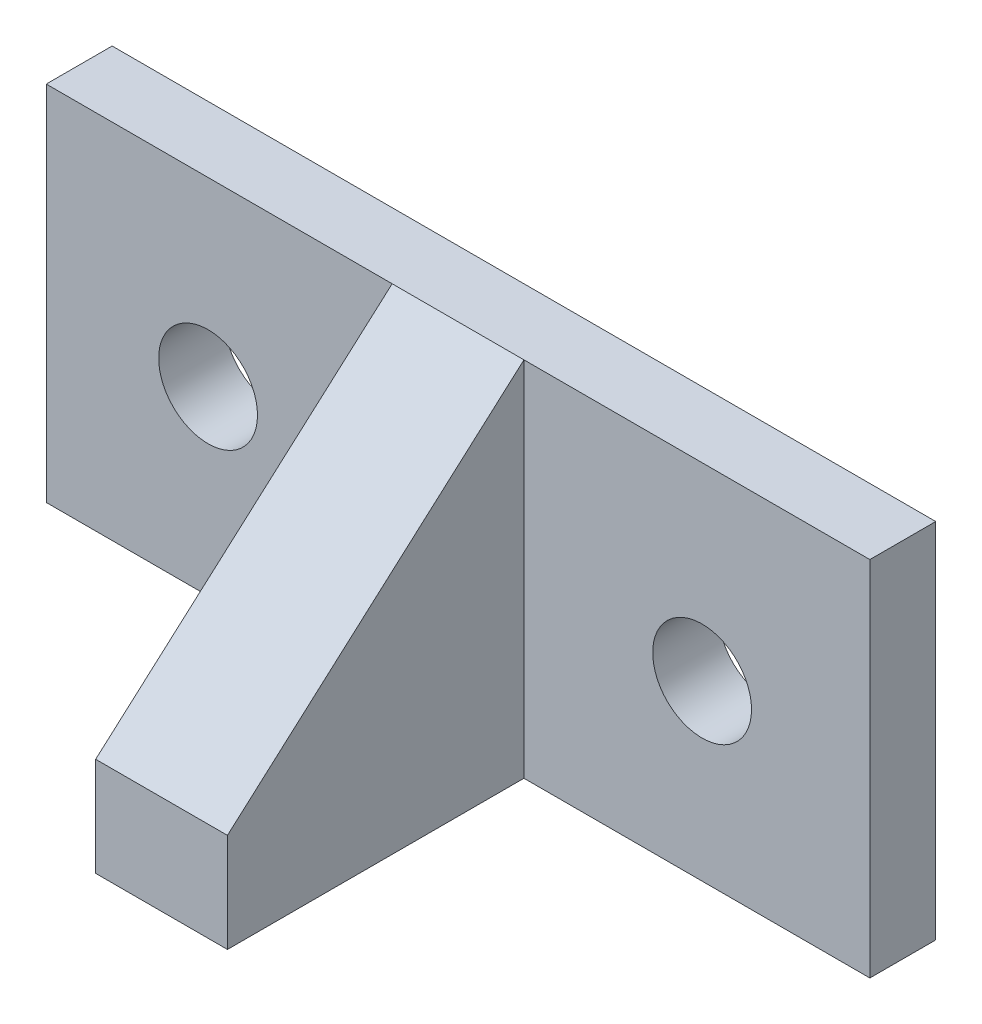
ISO-10303-21;
HEADER;
FILE_DESCRIPTION(('STEP AP214'),'2;1');
FILE_NAME('part.step','',(''),(''),'','','');
FILE_SCHEMA(('AUTOMOTIVE_DESIGN { 1 0 10303 214 1 1 1 1 }'));
ENDSEC;
DATA;
#1=APPLICATION_CONTEXT('core data for automotive mechanical design processes');
#2=APPLICATION_PROTOCOL_DEFINITION('international standard','automotive_design',2000,#1);
#3=PRODUCT_CONTEXT('',#1,'mechanical');
#4=PRODUCT('Part','Part','',(#3));
#5=PRODUCT_RELATED_PRODUCT_CATEGORY('part','',(#4));
#6=PRODUCT_DEFINITION_FORMATION('','',#4);
#7=PRODUCT_DEFINITION_CONTEXT('part definition',#1,'design');
#8=PRODUCT_DEFINITION('design','',#6,#7);
#9=PRODUCT_DEFINITION_SHAPE('','',#8);
#10=(LENGTH_UNIT() NAMED_UNIT(*) SI_UNIT(.MILLI.,.METRE.));
#11=(NAMED_UNIT(*) PLANE_ANGLE_UNIT() SI_UNIT($,.RADIAN.));
#12=(NAMED_UNIT(*) SI_UNIT($,.STERADIAN.) SOLID_ANGLE_UNIT());
#13=UNCERTAINTY_MEASURE_WITH_UNIT(LENGTH_MEASURE(1.E-05),#10,'distance_accuracy_value','');
#14=(GEOMETRIC_REPRESENTATION_CONTEXT(3) GLOBAL_UNCERTAINTY_ASSIGNED_CONTEXT((#13)) GLOBAL_UNIT_ASSIGNED_CONTEXT((#10,
#11,#12)) REPRESENTATION_CONTEXT('',''));
#15=CARTESIAN_POINT('',(0.,0.,0.));
#16=DIRECTION('',(0.,0.,1.));
#17=DIRECTION('',(1.,0.,0.));
#18=AXIS2_PLACEMENT_3D('',#15,#16,#17);
#19=CARTESIAN_POINT('',(-125.,0.,0.));
#20=DIRECTION('',(0.,0.,1.));
#21=DIRECTION('',(0.,-1.,0.));
#22=AXIS2_PLACEMENT_3D('',#19,#20,#21);
#23=PLANE('',#22);
#24=DIRECTION('',(0.,-1.,0.));
#25=VECTOR('',#24,1.);
#26=CARTESIAN_POINT('',(0.,0.,0.));
#27=LINE('',#26,#25);
#28=CARTESIAN_POINT('',(0.,27.5,0.));
#29=VERTEX_POINT('',#28);
#30=CARTESIAN_POINT('',(0.,-27.5,0.));
#31=VERTEX_POINT('',#30);
#32=EDGE_CURVE('E151',#29,#31,#27,.T.);
#33=ORIENTED_EDGE('',*,*,#32,.T.);
#34=DIRECTION('',(1.,0.,0.));
#35=VECTOR('',#34,1.);
#36=CARTESIAN_POINT('',(-125.,-27.5,0.));
#37=LINE('',#36,#35);
#38=CARTESIAN_POINT('',(-125.,-27.5,0.));
#39=VERTEX_POINT('',#38);
#40=EDGE_CURVE('E158',#39,#31,#37,.T.);
#41=ORIENTED_EDGE('',*,*,#40,.F.);
#42=DIRECTION('',(0.,-1.,0.));
#43=VECTOR('',#42,1.);
#44=CARTESIAN_POINT('',(-125.,0.,0.));
#45=LINE('',#44,#43);
#46=CARTESIAN_POINT('',(-125.,27.5,0.));
#47=VERTEX_POINT('',#46);
#48=EDGE_CURVE('E84',#47,#39,#45,.T.);
#49=ORIENTED_EDGE('',*,*,#48,.F.);
#50=DIRECTION('',(1.,0.,0.));
#51=VECTOR('',#50,1.);
#52=CARTESIAN_POINT('',(-125.,27.5,0.));
#53=LINE('',#52,#51);
#54=EDGE_CURVE('E76',#47,#29,#53,.T.);
#55=ORIENTED_EDGE('',*,*,#54,.T.);
#56=EDGE_LOOP('',(#33,#41,#49,#55));
#57=FACE_BOUND('',#56,.T.);
#58=CARTESIAN_POINT('',(-25.4583260394732,-1.19751441819342,0.));
#59=DIRECTION('',(0.,0.,1.));
#60=DIRECTION('',(1.,0.,0.));
#61=AXIS2_PLACEMENT_3D('',#58,#59,#60);
#62=CIRCLE('',#61,7.5);
#63=CARTESIAN_POINT('',(-17.9583260394732,-1.19751441819342,0.));
#64=VERTEX_POINT('',#63);
#65=EDGE_CURVE('E192',#64,#64,#62,.F.);
#66=ORIENTED_EDGE('',*,*,#65,.F.);
#67=EDGE_LOOP('',(#66));
#68=FACE_BOUND('',#67,.T.);
#69=CARTESIAN_POINT('',(-100.439200618626,0.,0.));
#70=DIRECTION('',(0.,0.,1.));
#71=DIRECTION('',(1.,0.,0.));
#72=AXIS2_PLACEMENT_3D('',#69,#70,#71);
#73=CIRCLE('',#72,7.5);
#74=CARTESIAN_POINT('',(-92.9392006186265,0.,0.));
#75=VERTEX_POINT('',#74);
#76=EDGE_CURVE('E189',#75,#75,#73,.T.);
#77=ORIENTED_EDGE('',*,*,#76,.T.);
#78=EDGE_LOOP('',(#77));
#79=FACE_BOUND('',#78,.T.);
#80=ADVANCED_FACE('F41',(#57,#68,#79),#23,.F.);
#81=CARTESIAN_POINT('',(-125.,20.3275862068966,18.0689655172414));
#82=DIRECTION('',(0.,-0.74740931868366,-0.66436383882992));
#83=DIRECTION('',(0.,0.66436383882992,-0.74740931868366));
#84=AXIS2_PLACEMENT_3D('',#81,#82,#83);
#85=PLANE('',#84);
#86=DIRECTION('',(0.,0.66436383882992,-0.74740931868366));
#87=VECTOR('',#86,1.);
#88=CARTESIAN_POINT('',(-72.5,20.3275862068966,18.0689655172414));
#89=LINE('',#88,#87);
#90=CARTESIAN_POINT('',(-72.5,-12.5,55.));
#91=VERTEX_POINT('',#90);
#92=CARTESIAN_POINT('',(-72.5,27.5,10.));
#93=VERTEX_POINT('',#92);
#94=EDGE_CURVE('E123',#91,#93,#89,.T.);
#95=ORIENTED_EDGE('',*,*,#94,.F.);
#96=DIRECTION('',(1.,0.,0.));
#97=VECTOR('',#96,1.);
#98=CARTESIAN_POINT('',(-125.,-12.5,55.));
#99=LINE('',#98,#97);
#100=CARTESIAN_POINT('',(-52.5,-12.5,55.));
#101=VERTEX_POINT('',#100);
#102=EDGE_CURVE('E44',#91,#101,#99,.T.);
#103=ORIENTED_EDGE('',*,*,#102,.T.);
#104=DIRECTION('',(0.,0.66436383882992,-0.74740931868366));
#105=VECTOR('',#104,1.);
#106=CARTESIAN_POINT('',(-52.5,20.3275862068966,18.0689655172414));
#107=LINE('',#106,#105);
#108=CARTESIAN_POINT('',(-52.5,27.5,10.));
#109=VERTEX_POINT('',#108);
#110=EDGE_CURVE('E131',#101,#109,#107,.T.);
#111=ORIENTED_EDGE('',*,*,#110,.T.);
#112=DIRECTION('',(1.,0.,0.));
#113=VECTOR('',#112,1.);
#114=CARTESIAN_POINT('',(-125.,27.5,10.));
#115=LINE('',#114,#113);
#116=EDGE_CURVE('E49',#93,#109,#115,.T.);
#117=ORIENTED_EDGE('',*,*,#116,.F.);
#118=EDGE_LOOP('',(#95,#103,#111,#117));
#119=FACE_BOUND('',#118,.T.);
#120=ADVANCED_FACE('F43',(#119),#85,.F.);
#121=CARTESIAN_POINT('',(-125.,0.,55.));
#122=DIRECTION('',(0.,0.,-1.));
#123=DIRECTION('',(-1.,0.,0.));
#124=AXIS2_PLACEMENT_3D('',#121,#122,#123);
#125=PLANE('',#124);
#126=DIRECTION('',(0.,1.,0.));
#127=VECTOR('',#126,1.);
#128=CARTESIAN_POINT('',(-72.5,0.,55.));
#129=LINE('',#128,#127);
#130=CARTESIAN_POINT('',(-72.5,-27.5,55.));
#131=VERTEX_POINT('',#130);
#132=EDGE_CURVE('E130',#131,#91,#129,.T.);
#133=ORIENTED_EDGE('',*,*,#132,.F.);
#134=DIRECTION('',(1.,0.,0.));
#135=VECTOR('',#134,1.);
#136=CARTESIAN_POINT('',(-125.,-27.5,55.));
#137=LINE('',#136,#135);
#138=CARTESIAN_POINT('',(-52.5,-27.5,55.));
#139=VERTEX_POINT('',#138);
#140=EDGE_CURVE('E141',#131,#139,#137,.T.);
#141=ORIENTED_EDGE('',*,*,#140,.T.);
#142=DIRECTION('',(0.,1.,0.));
#143=VECTOR('',#142,1.);
#144=CARTESIAN_POINT('',(-52.5,0.,55.));
#145=LINE('',#144,#143);
#146=EDGE_CURVE('E164',#139,#101,#145,.T.);
#147=ORIENTED_EDGE('',*,*,#146,.T.);
#148=ORIENTED_EDGE('',*,*,#102,.F.);
#149=EDGE_LOOP('',(#133,#141,#147,#148));
#150=FACE_BOUND('',#149,.T.);
#151=ADVANCED_FACE('F163',(#150),#125,.F.);
#152=CARTESIAN_POINT('',(-125.,0.,0.));
#153=DIRECTION('',(1.,0.,0.));
#154=DIRECTION('',(0.,0.,-1.));
#155=AXIS2_PLACEMENT_3D('',#152,#153,#154);
#156=PLANE('',#155);
#157=DIRECTION('',(0.,-1.,0.));
#158=VECTOR('',#157,1.);
#159=CARTESIAN_POINT('',(-125.,0.,10.));
#160=LINE('',#159,#158);
#161=CARTESIAN_POINT('',(-125.,27.5,10.));
#162=VERTEX_POINT('',#161);
#163=CARTESIAN_POINT('',(-125.,-27.5,10.));
#164=VERTEX_POINT('',#163);
#165=EDGE_CURVE('E128',#162,#164,#160,.T.);
#166=ORIENTED_EDGE('',*,*,#165,.F.);
#167=DIRECTION('',(0.,0.,1.));
#168=VECTOR('',#167,1.);
#169=CARTESIAN_POINT('',(-125.,27.5,0.));
#170=LINE('',#169,#168);
#171=EDGE_CURVE('E143',#47,#162,#170,.T.);
#172=ORIENTED_EDGE('',*,*,#171,.F.);
#173=ORIENTED_EDGE('',*,*,#48,.T.);
#174=DIRECTION('',(0.,0.,1.));
#175=VECTOR('',#174,1.);
#176=CARTESIAN_POINT('',(-125.,-27.5,0.));
#177=LINE('',#176,#175);
#178=EDGE_CURVE('E145',#39,#164,#177,.T.);
#179=ORIENTED_EDGE('',*,*,#178,.T.);
#180=EDGE_LOOP('',(#166,#172,#173,#179));
#181=FACE_BOUND('',#180,.T.);
#182=ADVANCED_FACE('F181',(#181),#156,.F.);
#183=CARTESIAN_POINT('',(0.,0.,0.));
#184=DIRECTION('',(1.,0.,0.));
#185=DIRECTION('',(0.,0.,-1.));
#186=AXIS2_PLACEMENT_3D('',#183,#184,#185);
#187=PLANE('',#186);
#188=DIRECTION('',(0.,0.,1.));
#189=VECTOR('',#188,1.);
#190=CARTESIAN_POINT('',(0.,27.5,0.));
#191=LINE('',#190,#189);
#192=CARTESIAN_POINT('',(0.,27.5,10.));
#193=VERTEX_POINT('',#192);
#194=EDGE_CURVE('E152',#29,#193,#191,.T.);
#195=ORIENTED_EDGE('',*,*,#194,.T.);
#196=DIRECTION('',(0.,-1.,0.));
#197=VECTOR('',#196,1.);
#198=CARTESIAN_POINT('',(0.,0.,10.));
#199=LINE('',#198,#197);
#200=CARTESIAN_POINT('',(0.,-27.5,10.));
#201=VERTEX_POINT('',#200);
#202=EDGE_CURVE('E177',#193,#201,#199,.T.);
#203=ORIENTED_EDGE('',*,*,#202,.T.);
#204=DIRECTION('',(0.,0.,1.));
#205=VECTOR('',#204,1.);
#206=CARTESIAN_POINT('',(0.,-27.5,0.));
#207=LINE('',#206,#205);
#208=EDGE_CURVE('E146',#31,#201,#207,.T.);
#209=ORIENTED_EDGE('',*,*,#208,.F.);
#210=ORIENTED_EDGE('',*,*,#32,.F.);
#211=EDGE_LOOP('',(#195,#203,#209,#210));
#212=FACE_BOUND('',#211,.T.);
#213=ADVANCED_FACE('F234',(#212),#187,.T.);
#214=CARTESIAN_POINT('',(-125.,27.5,0.));
#215=DIRECTION('',(0.,1.,0.));
#216=DIRECTION('',(0.,0.,1.));
#217=AXIS2_PLACEMENT_3D('',#214,#215,#216);
#218=PLANE('',#217);
#219=ORIENTED_EDGE('',*,*,#194,.F.);
#220=ORIENTED_EDGE('',*,*,#54,.F.);
#221=ORIENTED_EDGE('',*,*,#171,.T.);
#222=EDGE_CURVE('E11',#162,#93,#115,.T.);
#223=ORIENTED_EDGE('',*,*,#222,.T.);
#224=ORIENTED_EDGE('',*,*,#116,.T.);
#225=DIRECTION('',(1.,0.,0.));
#226=VECTOR('',#225,1.);
#227=CARTESIAN_POINT('',(-52.5,27.5,10.));
#228=LINE('',#227,#226);
#229=EDGE_CURVE('E155',#109,#193,#228,.T.);
#230=ORIENTED_EDGE('',*,*,#229,.T.);
#231=EDGE_LOOP('',(#219,#220,#221,#223,#224,#230));
#232=FACE_BOUND('',#231,.T.);
#233=ADVANCED_FACE('F139',(#232),#218,.T.);
#234=CARTESIAN_POINT('',(-125.,-27.5,0.));
#235=DIRECTION('',(0.,1.,0.));
#236=DIRECTION('',(0.,0.,1.));
#237=AXIS2_PLACEMENT_3D('',#234,#235,#236);
#238=PLANE('',#237);
#239=DIRECTION('',(0.,0.,1.));
#240=VECTOR('',#239,1.);
#241=CARTESIAN_POINT('',(-72.5,-27.5,0.));
#242=LINE('',#241,#240);
#243=CARTESIAN_POINT('',(-72.5,-27.5,10.));
#244=VERTEX_POINT('',#243);
#245=EDGE_CURVE('E118',#244,#131,#242,.T.);
#246=ORIENTED_EDGE('',*,*,#245,.F.);
#247=DIRECTION('',(-1.,0.,0.));
#248=VECTOR('',#247,1.);
#249=CARTESIAN_POINT('',(-72.5,-27.5,10.));
#250=LINE('',#249,#248);
#251=EDGE_CURVE('E120',#244,#164,#250,.T.);
#252=ORIENTED_EDGE('',*,*,#251,.T.);
#253=ORIENTED_EDGE('',*,*,#178,.F.);
#254=ORIENTED_EDGE('',*,*,#40,.T.);
#255=ORIENTED_EDGE('',*,*,#208,.T.);
#256=DIRECTION('',(1.,0.,0.));
#257=VECTOR('',#256,1.);
#258=CARTESIAN_POINT('',(-52.5,-27.5,10.));
#259=LINE('',#258,#257);
#260=CARTESIAN_POINT('',(-52.5,-27.5,10.));
#261=VERTEX_POINT('',#260);
#262=EDGE_CURVE('E59',#261,#201,#259,.T.);
#263=ORIENTED_EDGE('',*,*,#262,.F.);
#264=DIRECTION('',(0.,0.,1.));
#265=VECTOR('',#264,1.);
#266=CARTESIAN_POINT('',(-52.5,-27.5,0.));
#267=LINE('',#266,#265);
#268=EDGE_CURVE('E172',#261,#139,#267,.T.);
#269=ORIENTED_EDGE('',*,*,#268,.T.);
#270=ORIENTED_EDGE('',*,*,#140,.F.);
#271=EDGE_LOOP('',(#246,#252,#253,#254,#255,#263,#269,#270));
#272=FACE_BOUND('',#271,.T.);
#273=ADVANCED_FACE('F174',(#272),#238,.F.);
#274=CARTESIAN_POINT('',(-52.5,0.,10.));
#275=DIRECTION('',(0.,0.,1.));
#276=DIRECTION('',(1.,0.,0.));
#277=AXIS2_PLACEMENT_3D('',#274,#275,#276);
#278=PLANE('',#277);
#279=CARTESIAN_POINT('',(-25.4583260394732,-1.19751441819342,10.));
#280=DIRECTION('',(0.,0.,1.));
#281=DIRECTION('',(1.,0.,0.));
#282=AXIS2_PLACEMENT_3D('',#279,#280,#281);
#283=CIRCLE('',#282,7.5);
#284=CARTESIAN_POINT('',(-17.9583260394732,-1.19751441819342,10.));
#285=VERTEX_POINT('',#284);
#286=EDGE_CURVE('E193',#285,#285,#283,.F.);
#287=ORIENTED_EDGE('',*,*,#286,.T.);
#288=EDGE_LOOP('',(#287));
#289=FACE_BOUND('',#288,.T.);
#290=ORIENTED_EDGE('',*,*,#202,.F.);
#291=ORIENTED_EDGE('',*,*,#229,.F.);
#292=DIRECTION('',(0.,-1.,0.));
#293=VECTOR('',#292,1.);
#294=CARTESIAN_POINT('',(-52.5,0.,10.));
#295=LINE('',#294,#293);
#296=EDGE_CURVE('E171',#109,#261,#295,.T.);
#297=ORIENTED_EDGE('',*,*,#296,.T.);
#298=ORIENTED_EDGE('',*,*,#262,.T.);
#299=EDGE_LOOP('',(#290,#291,#297,#298));
#300=FACE_BOUND('',#299,.T.);
#301=ADVANCED_FACE('F218',(#289,#300),#278,.T.);
#302=CARTESIAN_POINT('',(-52.5,0.,0.));
#303=DIRECTION('',(1.,0.,0.));
#304=DIRECTION('',(0.,0.,-1.));
#305=AXIS2_PLACEMENT_3D('',#302,#303,#304);
#306=PLANE('',#305);
#307=ORIENTED_EDGE('',*,*,#110,.F.);
#308=ORIENTED_EDGE('',*,*,#146,.F.);
#309=ORIENTED_EDGE('',*,*,#268,.F.);
#310=ORIENTED_EDGE('',*,*,#296,.F.);
#311=EDGE_LOOP('',(#307,#308,#309,#310));
#312=FACE_BOUND('',#311,.T.);
#313=ADVANCED_FACE('F168',(#312),#306,.T.);
#314=CARTESIAN_POINT('',(-72.5,0.,10.));
#315=DIRECTION('',(0.,0.,-1.));
#316=DIRECTION('',(-1.,0.,0.));
#317=AXIS2_PLACEMENT_3D('',#314,#315,#316);
#318=PLANE('',#317);
#319=CARTESIAN_POINT('',(-100.439200618626,0.,10.));
#320=DIRECTION('',(0.,0.,1.));
#321=DIRECTION('',(1.,0.,0.));
#322=AXIS2_PLACEMENT_3D('',#319,#320,#321);
#323=CIRCLE('',#322,7.5);
#324=CARTESIAN_POINT('',(-92.9392006186265,0.,10.));
#325=VERTEX_POINT('',#324);
#326=EDGE_CURVE('E197',#325,#325,#323,.T.);
#327=ORIENTED_EDGE('',*,*,#326,.F.);
#328=EDGE_LOOP('',(#327));
#329=FACE_BOUND('',#328,.T.);
#330=ORIENTED_EDGE('',*,*,#165,.T.);
#331=ORIENTED_EDGE('',*,*,#251,.F.);
#332=DIRECTION('',(0.,-1.,0.));
#333=VECTOR('',#332,1.);
#334=CARTESIAN_POINT('',(-72.5,0.,10.));
#335=LINE('',#334,#333);
#336=EDGE_CURVE('E114',#93,#244,#335,.T.);
#337=ORIENTED_EDGE('',*,*,#336,.F.);
#338=ORIENTED_EDGE('',*,*,#222,.F.);
#339=EDGE_LOOP('',(#330,#331,#337,#338));
#340=FACE_BOUND('',#339,.T.);
#341=ADVANCED_FACE('F113',(#329,#340),#318,.F.);
#342=CARTESIAN_POINT('',(-72.5,0.,0.));
#343=DIRECTION('',(-1.,0.,0.));
#344=DIRECTION('',(0.,0.,1.));
#345=AXIS2_PLACEMENT_3D('',#342,#343,#344);
#346=PLANE('',#345);
#347=ORIENTED_EDGE('',*,*,#94,.T.);
#348=ORIENTED_EDGE('',*,*,#336,.T.);
#349=ORIENTED_EDGE('',*,*,#245,.T.);
#350=ORIENTED_EDGE('',*,*,#132,.T.);
#351=EDGE_LOOP('',(#347,#348,#349,#350));
#352=FACE_BOUND('',#351,.T.);
#353=ADVANCED_FACE('F124',(#352),#346,.T.);
#354=CARTESIAN_POINT('',(-100.439200618626,0.,0.));
#355=DIRECTION('',(0.,0.,1.));
#356=DIRECTION('',(1.,0.,0.));
#357=AXIS2_PLACEMENT_3D('',#354,#355,#356);
#358=CYLINDRICAL_SURFACE('',#357,7.5);
#359=ORIENTED_EDGE('',*,*,#76,.F.);
#360=EDGE_LOOP('',(#359));
#361=FACE_BOUND('',#360,.T.);
#362=ORIENTED_EDGE('',*,*,#326,.T.);
#363=EDGE_LOOP('',(#362));
#364=FACE_BOUND('',#363,.T.);
#365=ADVANCED_FACE('F204',(#361,#364),#358,.F.);
#366=CARTESIAN_POINT('',(-25.4583260394732,-1.19751441819342,0.));
#367=DIRECTION('',(0.,0.,1.));
#368=DIRECTION('',(1.,0.,0.));
#369=AXIS2_PLACEMENT_3D('',#366,#367,#368);
#370=CYLINDRICAL_SURFACE('',#369,7.5);
#371=ORIENTED_EDGE('',*,*,#65,.T.);
#372=EDGE_LOOP('',(#371));
#373=FACE_BOUND('',#372,.T.);
#374=ORIENTED_EDGE('',*,*,#286,.F.);
#375=EDGE_LOOP('',(#374));
#376=FACE_BOUND('',#375,.T.);
#377=ADVANCED_FACE('F210',(#373,#376),#370,.F.);
#378=CLOSED_SHELL('',(#80,#120,#151,#182,#213,#233,#273,#301,#313,#341,#353,#365,#377));
#379=MANIFOLD_SOLID_BREP('B2',#378);
#380=ADVANCED_BREP_SHAPE_REPRESENTATION('',(#18,#379),#14);
#381=SHAPE_DEFINITION_REPRESENTATION(#9,#380);
ENDSEC;
END-ISO-10303-21;
